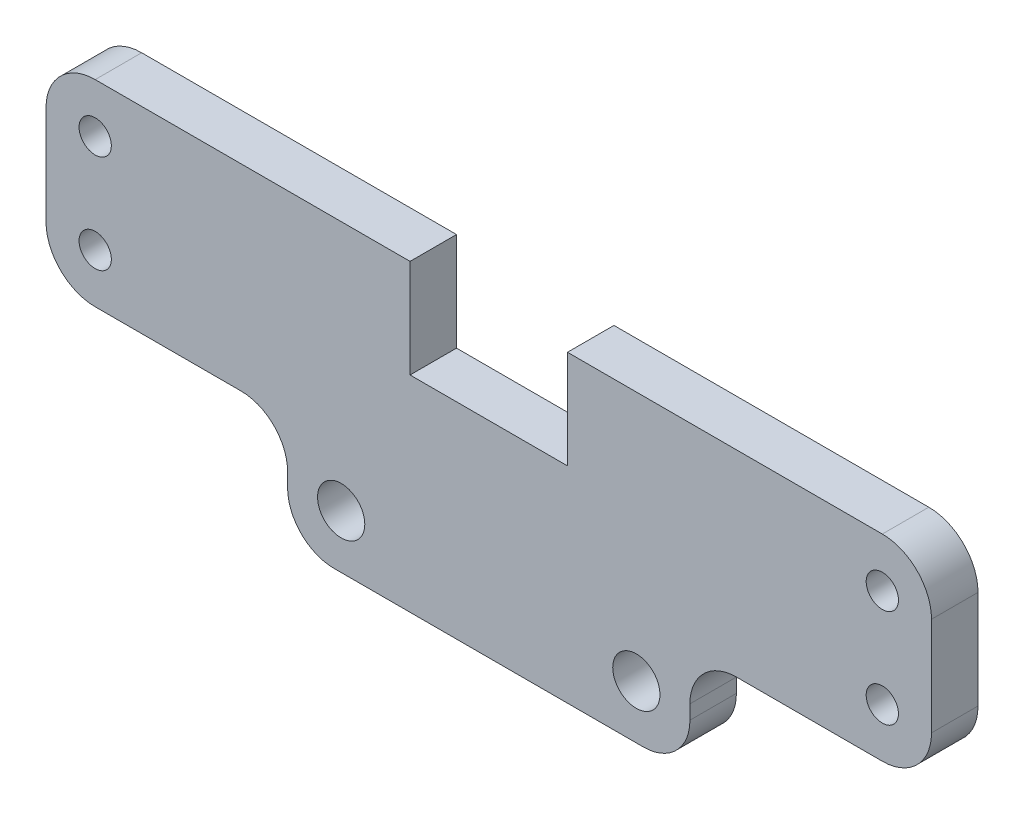
ISO-10303-21;
HEADER;
FILE_DESCRIPTION(('STEP AP214'),'2;1');
FILE_NAME('part.step','',(''),(''),'','','');
FILE_SCHEMA(('AUTOMOTIVE_DESIGN { 1 0 10303 214 1 1 1 1 }'));
ENDSEC;
DATA;
#1=APPLICATION_CONTEXT('core data for automotive mechanical design processes');
#2=APPLICATION_PROTOCOL_DEFINITION('international standard','automotive_design',2000,#1);
#3=PRODUCT_CONTEXT('',#1,'mechanical');
#4=PRODUCT('Part','Part','',(#3));
#5=PRODUCT_RELATED_PRODUCT_CATEGORY('part','',(#4));
#6=PRODUCT_DEFINITION_FORMATION('','',#4);
#7=PRODUCT_DEFINITION_CONTEXT('part definition',#1,'design');
#8=PRODUCT_DEFINITION('design','',#6,#7);
#9=PRODUCT_DEFINITION_SHAPE('','',#8);
#10=(LENGTH_UNIT() NAMED_UNIT(*) SI_UNIT(.MILLI.,.METRE.));
#11=(NAMED_UNIT(*) PLANE_ANGLE_UNIT() SI_UNIT($,.RADIAN.));
#12=(NAMED_UNIT(*) SI_UNIT($,.STERADIAN.) SOLID_ANGLE_UNIT());
#13=UNCERTAINTY_MEASURE_WITH_UNIT(LENGTH_MEASURE(1.E-05),#10,'distance_accuracy_value','');
#14=(GEOMETRIC_REPRESENTATION_CONTEXT(3) GLOBAL_UNCERTAINTY_ASSIGNED_CONTEXT((#13)) GLOBAL_UNIT_ASSIGNED_CONTEXT((#10,
#11,#12)) REPRESENTATION_CONTEXT('',''));
#15=CARTESIAN_POINT('',(0.,0.,0.));
#16=DIRECTION('',(0.,0.,1.));
#17=DIRECTION('',(1.,0.,0.));
#18=AXIS2_PLACEMENT_3D('',#15,#16,#17);
#19=CARTESIAN_POINT('',(-82.07375,-42.06875,3.));
#20=DIRECTION('',(0.,1.,0.));
#21=DIRECTION('',(0.,0.,1.));
#22=AXIS2_PLACEMENT_3D('',#19,#20,#21);
#23=PLANE('',#22);
#24=DIRECTION('',(1.,0.,0.));
#25=VECTOR('',#24,1.);
#26=CARTESIAN_POINT('',(-82.07375,-42.06875,3.));
#27=LINE('',#26,#25);
#28=CARTESIAN_POINT('',(0.691047213223217,-42.06875,3.));
#29=VERTEX_POINT('',#28);
#30=CARTESIAN_POINT('',(19.52625,-42.06875,3.));
#31=VERTEX_POINT('',#30);
#32=EDGE_CURVE('E283',#29,#31,#27,.T.);
#33=ORIENTED_EDGE('',*,*,#32,.F.);
#34=DIRECTION('',(0.,0.,1.));
#35=VECTOR('',#34,1.);
#36=CARTESIAN_POINT('',(0.69104721322324,-42.06875,-3.));
#37=LINE('',#36,#35);
#38=CARTESIAN_POINT('',(0.691047213223217,-42.06875,-3.));
#39=VERTEX_POINT('',#38);
#40=EDGE_CURVE('E55',#29,#39,#37,.F.);
#41=ORIENTED_EDGE('',*,*,#40,.T.);
#42=DIRECTION('',(1.,0.,0.));
#43=VECTOR('',#42,1.);
#44=CARTESIAN_POINT('',(-82.07375,-42.06875,-3.));
#45=LINE('',#44,#43);
#46=CARTESIAN_POINT('',(19.52625,-42.06875,-3.));
#47=VERTEX_POINT('',#46);
#48=EDGE_CURVE('E296',#39,#47,#45,.T.);
#49=ORIENTED_EDGE('',*,*,#48,.T.);
#50=DIRECTION('',(0.,0.,-1.));
#51=VECTOR('',#50,1.);
#52=CARTESIAN_POINT('',(19.52625,-42.06875,3.));
#53=LINE('',#52,#51);
#54=EDGE_CURVE('E236',#31,#47,#53,.T.);
#55=ORIENTED_EDGE('',*,*,#54,.F.);
#56=EDGE_LOOP('',(#33,#41,#49,#55));
#57=FACE_BOUND('',#56,.T.);
#58=ADVANCED_FACE('F40',(#57),#23,.F.);
#59=CARTESIAN_POINT('',(-82.0737500000001,-16.66875,3.));
#60=DIRECTION('',(0.,-1.,0.));
#61=DIRECTION('',(0.,0.,-1.));
#62=AXIS2_PLACEMENT_3D('',#59,#60,#61);
#63=PLANE('',#62);
#64=DIRECTION('',(-1.,0.,0.));
#65=VECTOR('',#64,1.);
#66=CARTESIAN_POINT('',(-82.0737500000001,-16.66875,-3.));
#67=LINE('',#66,#65);
#68=CARTESIAN_POINT('',(19.52625,-16.66875,-3.));
#69=VERTEX_POINT('',#68);
#70=CARTESIAN_POINT('',(-21.11375,-16.66875,-3.));
#71=VERTEX_POINT('',#70);
#72=EDGE_CURVE('E202',#69,#71,#67,.T.);
#73=ORIENTED_EDGE('',*,*,#72,.T.);
#74=DIRECTION('',(0.,0.,1.));
#75=VECTOR('',#74,1.);
#76=CARTESIAN_POINT('',(-21.11375,-16.66875,-3.));
#77=LINE('',#76,#75);
#78=CARTESIAN_POINT('',(-21.11375,-16.66875,3.));
#79=VERTEX_POINT('',#78);
#80=EDGE_CURVE('E183',#71,#79,#77,.T.);
#81=ORIENTED_EDGE('',*,*,#80,.T.);
#82=DIRECTION('',(-1.,0.,0.));
#83=VECTOR('',#82,1.);
#84=CARTESIAN_POINT('',(-82.0737500000001,-16.66875,3.));
#85=LINE('',#84,#83);
#86=CARTESIAN_POINT('',(19.52625,-16.66875,3.));
#87=VERTEX_POINT('',#86);
#88=EDGE_CURVE('E228',#87,#79,#85,.T.);
#89=ORIENTED_EDGE('',*,*,#88,.F.);
#90=DIRECTION('',(0.,0.,-1.));
#91=VECTOR('',#90,1.);
#92=CARTESIAN_POINT('',(19.52625,-16.66875,3.));
#93=LINE('',#92,#91);
#94=EDGE_CURVE('E211',#87,#69,#93,.T.);
#95=ORIENTED_EDGE('',*,*,#94,.T.);
#96=EDGE_LOOP('',(#73,#81,#89,#95));
#97=FACE_BOUND('',#96,.T.);
#98=ADVANCED_FACE('F209',(#97),#63,.F.);
#99=CARTESIAN_POINT('',(-82.07375,-23.01875,3.));
#100=DIRECTION('',(0.,0.,-1.));
#101=DIRECTION('',(-1.,0.,0.));
#102=AXIS2_PLACEMENT_3D('',#99,#100,#101);
#103=PLANE('',#102);
#104=DIRECTION('',(1.,0.,0.));
#105=VECTOR('',#104,1.);
#106=CARTESIAN_POINT('',(-57.2385472132233,-55.8983444264465,3.));
#107=LINE('',#106,#105);
#108=CARTESIAN_POINT('',(-51.2385472132233,-55.8983444264465,3.));
#109=VERTEX_POINT('',#108);
#110=CARTESIAN_POINT('',(-11.3089527867768,-55.8983444264465,3.));
#111=VERTEX_POINT('',#110);
#112=EDGE_CURVE('E316',#109,#111,#107,.T.);
#113=ORIENTED_EDGE('',*,*,#112,.T.);
#114=CARTESIAN_POINT('',(-11.3089527867768,-49.8983444264465,3.));
#115=DIRECTION('',(0.,0.,-1.));
#116=DIRECTION('',(-1.,0.,0.));
#117=AXIS2_PLACEMENT_3D('',#114,#115,#116);
#118=CIRCLE('',#117,6.);
#119=CARTESIAN_POINT('',(-5.30895278677676,-49.8983444264465,3.));
#120=VERTEX_POINT('',#119);
#121=EDGE_CURVE('E270',#111,#120,#118,.F.);
#122=ORIENTED_EDGE('',*,*,#121,.T.);
#123=DIRECTION('',(0.,-1.,0.));
#124=VECTOR('',#123,1.);
#125=CARTESIAN_POINT('',(-5.30895278677676,-55.8983444264465,3.));
#126=LINE('',#125,#124);
#127=CARTESIAN_POINT('',(-5.30895278677676,-48.06875,3.));
#128=VERTEX_POINT('',#127);
#129=EDGE_CURVE('E285',#128,#120,#126,.T.);
#130=ORIENTED_EDGE('',*,*,#129,.F.);
#131=CARTESIAN_POINT('',(0.69104721322324,-48.06875,3.));
#132=DIRECTION('',(0.,0.,-1.));
#133=DIRECTION('',(-1.,0.,0.));
#134=AXIS2_PLACEMENT_3D('',#131,#132,#133);
#135=CIRCLE('',#134,6.);
#136=EDGE_CURVE('E48',#128,#29,#135,.T.);
#137=ORIENTED_EDGE('',*,*,#136,.T.);
#138=ORIENTED_EDGE('',*,*,#32,.T.);
#139=CARTESIAN_POINT('',(19.52625,-35.71875,3.));
#140=DIRECTION('',(0.,0.,1.));
#141=DIRECTION('',(1.,0.,0.));
#142=AXIS2_PLACEMENT_3D('',#139,#140,#141);
#143=CIRCLE('',#142,6.35);
#144=CARTESIAN_POINT('',(25.87625,-35.71875,3.));
#145=VERTEX_POINT('',#144);
#146=EDGE_CURVE('E367',#31,#145,#143,.T.);
#147=ORIENTED_EDGE('',*,*,#146,.T.);
#148=DIRECTION('',(0.,1.,0.));
#149=VECTOR('',#148,1.);
#150=CARTESIAN_POINT('',(25.87625,-35.71875,3.));
#151=LINE('',#150,#149);
#152=CARTESIAN_POINT('',(25.87625,-23.01875,3.));
#153=VERTEX_POINT('',#152);
#154=EDGE_CURVE('E369',#145,#153,#151,.T.);
#155=ORIENTED_EDGE('',*,*,#154,.T.);
#156=CARTESIAN_POINT('',(19.52625,-23.01875,3.));
#157=DIRECTION('',(0.,0.,1.));
#158=DIRECTION('',(-1.,0.,0.));
#159=AXIS2_PLACEMENT_3D('',#156,#157,#158);
#160=CIRCLE('',#159,6.35);
#161=EDGE_CURVE('E371',#153,#87,#160,.T.);
#162=ORIENTED_EDGE('',*,*,#161,.T.);
#163=ORIENTED_EDGE('',*,*,#88,.T.);
#164=DIRECTION('',(0.,1.,0.));
#165=VECTOR('',#164,1.);
#166=CARTESIAN_POINT('',(-21.11375,-16.66875,3.));
#167=LINE('',#166,#165);
#168=CARTESIAN_POINT('',(-21.11375,-29.36875,3.));
#169=VERTEX_POINT('',#168);
#170=EDGE_CURVE('E189',#169,#79,#167,.T.);
#171=ORIENTED_EDGE('',*,*,#170,.F.);
#172=DIRECTION('',(1.,0.,0.));
#173=VECTOR('',#172,1.);
#174=CARTESIAN_POINT('',(-21.11375,-29.36875,3.));
#175=LINE('',#174,#173);
#176=CARTESIAN_POINT('',(-41.43375,-29.36875,3.));
#177=VERTEX_POINT('',#176);
#178=EDGE_CURVE('E206',#177,#169,#175,.T.);
#179=ORIENTED_EDGE('',*,*,#178,.F.);
#180=DIRECTION('',(0.,-1.,0.));
#181=VECTOR('',#180,1.);
#182=CARTESIAN_POINT('',(-41.43375,-16.66875,3.));
#183=LINE('',#182,#181);
#184=CARTESIAN_POINT('',(-41.43375,-16.66875,3.));
#185=VERTEX_POINT('',#184);
#186=EDGE_CURVE('E325',#185,#177,#183,.T.);
#187=ORIENTED_EDGE('',*,*,#186,.F.);
#188=CARTESIAN_POINT('',(-82.0737500000001,-16.66875,3.));
#189=VERTEX_POINT('',#188);
#190=EDGE_CURVE('E373',#185,#189,#85,.T.);
#191=ORIENTED_EDGE('',*,*,#190,.T.);
#192=CARTESIAN_POINT('',(-82.07375,-23.01875,3.));
#193=DIRECTION('',(0.,0.,1.));
#194=DIRECTION('',(-1.,0.,0.));
#195=AXIS2_PLACEMENT_3D('',#192,#193,#194);
#196=CIRCLE('',#195,6.34999999999998);
#197=CARTESIAN_POINT('',(-88.42375,-23.01875,3.));
#198=VERTEX_POINT('',#197);
#199=EDGE_CURVE('E212',#189,#198,#196,.T.);
#200=ORIENTED_EDGE('',*,*,#199,.T.);
#201=DIRECTION('',(0.,-1.,0.));
#202=VECTOR('',#201,1.);
#203=CARTESIAN_POINT('',(-88.42375,-23.01875,3.));
#204=LINE('',#203,#202);
#205=CARTESIAN_POINT('',(-88.42375,-35.71875,3.));
#206=VERTEX_POINT('',#205);
#207=EDGE_CURVE('E217',#198,#206,#204,.T.);
#208=ORIENTED_EDGE('',*,*,#207,.T.);
#209=CARTESIAN_POINT('',(-82.07375,-35.71875,3.));
#210=DIRECTION('',(0.,0.,1.));
#211=DIRECTION('',(1.,0.,0.));
#212=AXIS2_PLACEMENT_3D('',#209,#210,#211);
#213=CIRCLE('',#212,6.35);
#214=CARTESIAN_POINT('',(-82.07375,-42.06875,3.));
#215=VERTEX_POINT('',#214);
#216=EDGE_CURVE('E290',#206,#215,#213,.T.);
#217=ORIENTED_EDGE('',*,*,#216,.T.);
#218=CARTESIAN_POINT('',(-63.2385472132233,-42.06875,3.));
#219=VERTEX_POINT('',#218);
#220=EDGE_CURVE('E289',#215,#219,#27,.T.);
#221=ORIENTED_EDGE('',*,*,#220,.T.);
#222=CARTESIAN_POINT('',(-63.2385472132233,-48.06875,3.));
#223=DIRECTION('',(0.,0.,-1.));
#224=DIRECTION('',(-1.,0.,0.));
#225=AXIS2_PLACEMENT_3D('',#222,#223,#224);
#226=CIRCLE('',#225,6.);
#227=CARTESIAN_POINT('',(-57.2385472132233,-48.06875,3.));
#228=VERTEX_POINT('',#227);
#229=EDGE_CURVE('E263',#219,#228,#226,.T.);
#230=ORIENTED_EDGE('',*,*,#229,.T.);
#231=DIRECTION('',(0.,-1.,0.));
#232=VECTOR('',#231,1.);
#233=CARTESIAN_POINT('',(-57.2385472132233,-55.8983444264465,3.));
#234=LINE('',#233,#232);
#235=CARTESIAN_POINT('',(-57.2385472132233,-49.8983444264465,3.));
#236=VERTEX_POINT('',#235);
#237=EDGE_CURVE('E310',#228,#236,#234,.T.);
#238=ORIENTED_EDGE('',*,*,#237,.T.);
#239=CARTESIAN_POINT('',(-51.2385472132233,-49.8983444264465,3.));
#240=DIRECTION('',(0.,0.,-1.));
#241=DIRECTION('',(-1.,0.,0.));
#242=AXIS2_PLACEMENT_3D('',#239,#240,#241);
#243=CIRCLE('',#242,6.);
#244=EDGE_CURVE('E254',#236,#109,#243,.F.);
#245=ORIENTED_EDGE('',*,*,#244,.T.);
#246=EDGE_LOOP('',(#113,#122,#130,#137,#138,#147,#155,#162,#163,#171,#179,#187,#191,#200,#208,
#217,#221,#230,#238,#245));
#247=FACE_BOUND('',#246,.T.);
#248=CARTESIAN_POINT('',(-82.07375,-23.01875,3.));
#249=DIRECTION('',(0.,0.,1.));
#250=DIRECTION('',(1.,0.,0.));
#251=AXIS2_PLACEMENT_3D('',#248,#249,#250);
#252=CIRCLE('',#251,2.0828);
#253=CARTESIAN_POINT('',(-79.99095,-23.01875,3.));
#254=VERTEX_POINT('',#253);
#255=EDGE_CURVE('E355',#254,#254,#252,.T.);
#256=ORIENTED_EDGE('',*,*,#255,.F.);
#257=EDGE_LOOP('',(#256));
#258=FACE_BOUND('',#257,.T.);
#259=CARTESIAN_POINT('',(19.52625,-23.01875,3.));
#260=DIRECTION('',(0.,0.,1.));
#261=DIRECTION('',(1.,0.,0.));
#262=AXIS2_PLACEMENT_3D('',#259,#260,#261);
#263=CIRCLE('',#262,2.0828);
#264=CARTESIAN_POINT('',(21.60905,-23.01875,3.));
#265=VERTEX_POINT('',#264);
#266=EDGE_CURVE('E349',#265,#265,#263,.T.);
#267=ORIENTED_EDGE('',*,*,#266,.F.);
#268=EDGE_LOOP('',(#267));
#269=FACE_BOUND('',#268,.T.);
#270=CARTESIAN_POINT('',(-82.07375,-35.71875,3.));
#271=DIRECTION('',(0.,0.,1.));
#272=DIRECTION('',(1.,0.,0.));
#273=AXIS2_PLACEMENT_3D('',#270,#271,#272);
#274=CIRCLE('',#273,2.0828);
#275=CARTESIAN_POINT('',(-79.99095,-35.71875,3.));
#276=VERTEX_POINT('',#275);
#277=EDGE_CURVE('E342',#276,#276,#274,.T.);
#278=ORIENTED_EDGE('',*,*,#277,.F.);
#279=EDGE_LOOP('',(#278));
#280=FACE_BOUND('',#279,.T.);
#281=CARTESIAN_POINT('',(19.52625,-35.71875,3.));
#282=DIRECTION('',(0.,0.,1.));
#283=DIRECTION('',(1.,0.,0.));
#284=AXIS2_PLACEMENT_3D('',#281,#282,#283);
#285=CIRCLE('',#284,2.0828);
#286=CARTESIAN_POINT('',(21.60905,-35.71875,3.));
#287=VERTEX_POINT('',#286);
#288=EDGE_CURVE('E336',#287,#287,#285,.T.);
#289=ORIENTED_EDGE('',*,*,#288,.F.);
#290=EDGE_LOOP('',(#289));
#291=FACE_BOUND('',#290,.T.);
#292=CARTESIAN_POINT('',(-50.32375,-48.9835472132233,3.));
#293=DIRECTION('',(0.,0.,1.));
#294=DIRECTION('',(1.,0.,0.));
#295=AXIS2_PLACEMENT_3D('',#292,#293,#294);
#296=CIRCLE('',#295,3.048);
#297=CARTESIAN_POINT('',(-47.27575,-48.9835472132233,3.));
#298=VERTEX_POINT('',#297);
#299=EDGE_CURVE('E298',#298,#298,#296,.T.);
#300=ORIENTED_EDGE('',*,*,#299,.F.);
#301=EDGE_LOOP('',(#300));
#302=FACE_BOUND('',#301,.T.);
#303=CARTESIAN_POINT('',(-12.22375,-48.9835472132233,3.));
#304=DIRECTION('',(0.,0.,-1.));
#305=DIRECTION('',(-1.,0.,0.));
#306=AXIS2_PLACEMENT_3D('',#303,#304,#305);
#307=CIRCLE('',#306,3.048);
#308=CARTESIAN_POINT('',(-15.27175,-48.9835472132233,3.));
#309=VERTEX_POINT('',#308);
#310=EDGE_CURVE('E306',#309,#309,#307,.T.);
#311=ORIENTED_EDGE('',*,*,#310,.T.);
#312=EDGE_LOOP('',(#311));
#313=FACE_BOUND('',#312,.T.);
#314=ADVANCED_FACE('F281',(#247,#258,#269,#280,#291,#302,#313),#103,.F.);
#315=CARTESIAN_POINT('',(-82.07375,-23.01875,-3.));
#316=DIRECTION('',(0.,0.,-1.));
#317=DIRECTION('',(-1.,0.,0.));
#318=AXIS2_PLACEMENT_3D('',#315,#316,#317);
#319=PLANE('',#318);
#320=DIRECTION('',(0.,-1.,0.));
#321=VECTOR('',#320,1.);
#322=CARTESIAN_POINT('',(-5.30895278677676,-55.8983444264465,-3.));
#323=LINE('',#322,#321);
#324=CARTESIAN_POINT('',(-5.30895278677676,-48.06875,-3.));
#325=VERTEX_POINT('',#324);
#326=CARTESIAN_POINT('',(-5.30895278677676,-49.8983444264465,-3.));
#327=VERTEX_POINT('',#326);
#328=EDGE_CURVE('E293',#325,#327,#323,.T.);
#329=ORIENTED_EDGE('',*,*,#328,.T.);
#330=CARTESIAN_POINT('',(-11.3089527867768,-49.8983444264465,-3.));
#331=DIRECTION('',(0.,0.,-1.));
#332=DIRECTION('',(-1.,0.,0.));
#333=AXIS2_PLACEMENT_3D('',#330,#331,#332);
#334=CIRCLE('',#333,6.);
#335=CARTESIAN_POINT('',(-11.3089527867768,-55.8983444264465,-3.));
#336=VERTEX_POINT('',#335);
#337=EDGE_CURVE('E276',#327,#336,#334,.T.);
#338=ORIENTED_EDGE('',*,*,#337,.T.);
#339=DIRECTION('',(1.,0.,0.));
#340=VECTOR('',#339,1.);
#341=CARTESIAN_POINT('',(-57.2385472132233,-55.8983444264465,-3.));
#342=LINE('',#341,#340);
#343=CARTESIAN_POINT('',(-51.2385472132233,-55.8983444264465,-3.));
#344=VERTEX_POINT('',#343);
#345=EDGE_CURVE('E315',#344,#336,#342,.T.);
#346=ORIENTED_EDGE('',*,*,#345,.F.);
#347=CARTESIAN_POINT('',(-51.2385472132233,-49.8983444264465,-3.));
#348=DIRECTION('',(0.,0.,-1.));
#349=DIRECTION('',(-1.,0.,0.));
#350=AXIS2_PLACEMENT_3D('',#347,#348,#349);
#351=CIRCLE('',#350,6.);
#352=CARTESIAN_POINT('',(-57.2385472132233,-49.8983444264465,-3.));
#353=VERTEX_POINT('',#352);
#354=EDGE_CURVE('E258',#344,#353,#351,.T.);
#355=ORIENTED_EDGE('',*,*,#354,.T.);
#356=DIRECTION('',(0.,-1.,0.));
#357=VECTOR('',#356,1.);
#358=CARTESIAN_POINT('',(-57.2385472132233,-55.8983444264465,-3.));
#359=LINE('',#358,#357);
#360=CARTESIAN_POINT('',(-57.2385472132233,-48.06875,-3.));
#361=VERTEX_POINT('',#360);
#362=EDGE_CURVE('E312',#361,#353,#359,.T.);
#363=ORIENTED_EDGE('',*,*,#362,.F.);
#364=CARTESIAN_POINT('',(-63.2385472132233,-48.06875,-3.));
#365=DIRECTION('',(0.,0.,-1.));
#366=DIRECTION('',(-1.,0.,0.));
#367=AXIS2_PLACEMENT_3D('',#364,#365,#366);
#368=CIRCLE('',#367,6.);
#369=CARTESIAN_POINT('',(-63.2385472132233,-42.06875,-3.));
#370=VERTEX_POINT('',#369);
#371=EDGE_CURVE('E265',#361,#370,#368,.F.);
#372=ORIENTED_EDGE('',*,*,#371,.T.);
#373=CARTESIAN_POINT('',(-82.07375,-42.06875,-3.));
#374=VERTEX_POINT('',#373);
#375=EDGE_CURVE('E383',#374,#370,#45,.T.);
#376=ORIENTED_EDGE('',*,*,#375,.F.);
#377=CARTESIAN_POINT('',(-82.07375,-35.71875,-3.));
#378=DIRECTION('',(0.,0.,1.));
#379=DIRECTION('',(1.,0.,0.));
#380=AXIS2_PLACEMENT_3D('',#377,#378,#379);
#381=CIRCLE('',#380,6.35);
#382=CARTESIAN_POINT('',(-88.42375,-35.71875,-3.));
#383=VERTEX_POINT('',#382);
#384=EDGE_CURVE('E381',#383,#374,#381,.T.);
#385=ORIENTED_EDGE('',*,*,#384,.F.);
#386=DIRECTION('',(0.,-1.,0.));
#387=VECTOR('',#386,1.);
#388=CARTESIAN_POINT('',(-88.42375,-23.01875,-3.));
#389=LINE('',#388,#387);
#390=CARTESIAN_POINT('',(-88.42375,-23.01875,-3.));
#391=VERTEX_POINT('',#390);
#392=EDGE_CURVE('E378',#391,#383,#389,.T.);
#393=ORIENTED_EDGE('',*,*,#392,.F.);
#394=CARTESIAN_POINT('',(-82.07375,-23.01875,-3.));
#395=DIRECTION('',(0.,0.,1.));
#396=DIRECTION('',(-1.,0.,0.));
#397=AXIS2_PLACEMENT_3D('',#394,#395,#396);
#398=CIRCLE('',#397,6.34999999999998);
#399=CARTESIAN_POINT('',(-82.0737500000001,-16.66875,-3.));
#400=VERTEX_POINT('',#399);
#401=EDGE_CURVE('E359',#400,#391,#398,.T.);
#402=ORIENTED_EDGE('',*,*,#401,.F.);
#403=CARTESIAN_POINT('',(-41.43375,-16.66875,-3.));
#404=VERTEX_POINT('',#403);
#405=EDGE_CURVE('E213',#404,#400,#67,.T.);
#406=ORIENTED_EDGE('',*,*,#405,.F.);
#407=DIRECTION('',(0.,-1.,0.));
#408=VECTOR('',#407,1.);
#409=CARTESIAN_POINT('',(-41.43375,-16.66875,-3.));
#410=LINE('',#409,#408);
#411=CARTESIAN_POINT('',(-41.43375,-29.36875,-3.));
#412=VERTEX_POINT('',#411);
#413=EDGE_CURVE('E205',#404,#412,#410,.T.);
#414=ORIENTED_EDGE('',*,*,#413,.T.);
#415=DIRECTION('',(1.,0.,0.));
#416=VECTOR('',#415,1.);
#417=CARTESIAN_POINT('',(-21.11375,-29.36875,-3.));
#418=LINE('',#417,#416);
#419=CARTESIAN_POINT('',(-21.11375,-29.36875,-3.));
#420=VERTEX_POINT('',#419);
#421=EDGE_CURVE('E195',#412,#420,#418,.T.);
#422=ORIENTED_EDGE('',*,*,#421,.T.);
#423=DIRECTION('',(0.,1.,0.));
#424=VECTOR('',#423,1.);
#425=CARTESIAN_POINT('',(-21.11375,-16.66875,-3.));
#426=LINE('',#425,#424);
#427=EDGE_CURVE('E186',#420,#71,#426,.T.);
#428=ORIENTED_EDGE('',*,*,#427,.T.);
#429=ORIENTED_EDGE('',*,*,#72,.F.);
#430=CARTESIAN_POINT('',(19.52625,-23.01875,-3.));
#431=DIRECTION('',(0.,0.,1.));
#432=DIRECTION('',(-1.,0.,0.));
#433=AXIS2_PLACEMENT_3D('',#430,#431,#432);
#434=CIRCLE('',#433,6.35);
#435=CARTESIAN_POINT('',(25.87625,-23.01875,-3.));
#436=VERTEX_POINT('',#435);
#437=EDGE_CURVE('E220',#436,#69,#434,.T.);
#438=ORIENTED_EDGE('',*,*,#437,.F.);
#439=DIRECTION('',(0.,1.,0.));
#440=VECTOR('',#439,1.);
#441=CARTESIAN_POINT('',(25.87625,-35.71875,-3.));
#442=LINE('',#441,#440);
#443=CARTESIAN_POINT('',(25.87625,-35.71875,-3.));
#444=VERTEX_POINT('',#443);
#445=EDGE_CURVE('E387',#444,#436,#442,.T.);
#446=ORIENTED_EDGE('',*,*,#445,.F.);
#447=CARTESIAN_POINT('',(19.52625,-35.71875,-3.));
#448=DIRECTION('',(0.,0.,1.));
#449=DIRECTION('',(1.,0.,0.));
#450=AXIS2_PLACEMENT_3D('',#447,#448,#449);
#451=CIRCLE('',#450,6.35);
#452=EDGE_CURVE('E386',#47,#444,#451,.T.);
#453=ORIENTED_EDGE('',*,*,#452,.F.);
#454=ORIENTED_EDGE('',*,*,#48,.F.);
#455=CARTESIAN_POINT('',(0.69104721322324,-48.06875,-3.));
#456=DIRECTION('',(0.,0.,-1.));
#457=DIRECTION('',(-1.,0.,0.));
#458=AXIS2_PLACEMENT_3D('',#455,#456,#457);
#459=CIRCLE('',#458,6.);
#460=EDGE_CURVE('E11',#39,#325,#459,.F.);
#461=ORIENTED_EDGE('',*,*,#460,.T.);
#462=EDGE_LOOP('',(#329,#338,#346,#355,#363,#372,#376,#385,#393,#402,#406,#414,#422,#428,#429,
#438,#446,#453,#454,#461));
#463=FACE_BOUND('',#462,.T.);
#464=CARTESIAN_POINT('',(-82.07375,-35.71875,-3.));
#465=DIRECTION('',(0.,0.,1.));
#466=DIRECTION('',(1.,0.,0.));
#467=AXIS2_PLACEMENT_3D('',#464,#465,#466);
#468=CIRCLE('',#467,2.0828);
#469=CARTESIAN_POINT('',(-79.99095,-35.71875,-3.));
#470=VERTEX_POINT('',#469);
#471=EDGE_CURVE('E339',#470,#470,#468,.T.);
#472=ORIENTED_EDGE('',*,*,#471,.T.);
#473=EDGE_LOOP('',(#472));
#474=FACE_BOUND('',#473,.T.);
#475=CARTESIAN_POINT('',(-82.07375,-23.01875,-3.));
#476=DIRECTION('',(0.,0.,1.));
#477=DIRECTION('',(1.,0.,0.));
#478=AXIS2_PLACEMENT_3D('',#475,#476,#477);
#479=CIRCLE('',#478,2.0828);
#480=CARTESIAN_POINT('',(-79.99095,-23.01875,-3.));
#481=VERTEX_POINT('',#480);
#482=EDGE_CURVE('E352',#481,#481,#479,.T.);
#483=ORIENTED_EDGE('',*,*,#482,.T.);
#484=EDGE_LOOP('',(#483));
#485=FACE_BOUND('',#484,.T.);
#486=CARTESIAN_POINT('',(19.52625,-23.01875,-3.));
#487=DIRECTION('',(0.,0.,1.));
#488=DIRECTION('',(1.,0.,0.));
#489=AXIS2_PLACEMENT_3D('',#486,#487,#488);
#490=CIRCLE('',#489,2.0828);
#491=CARTESIAN_POINT('',(21.60905,-23.01875,-3.));
#492=VERTEX_POINT('',#491);
#493=EDGE_CURVE('E346',#492,#492,#490,.T.);
#494=ORIENTED_EDGE('',*,*,#493,.T.);
#495=EDGE_LOOP('',(#494));
#496=FACE_BOUND('',#495,.T.);
#497=CARTESIAN_POINT('',(19.52625,-35.71875,-3.));
#498=DIRECTION('',(0.,0.,1.));
#499=DIRECTION('',(1.,0.,0.));
#500=AXIS2_PLACEMENT_3D('',#497,#498,#499);
#501=CIRCLE('',#500,2.0828);
#502=CARTESIAN_POINT('',(21.60905,-35.71875,-3.));
#503=VERTEX_POINT('',#502);
#504=EDGE_CURVE('E332',#503,#503,#501,.T.);
#505=ORIENTED_EDGE('',*,*,#504,.T.);
#506=EDGE_LOOP('',(#505));
#507=FACE_BOUND('',#506,.T.);
#508=CARTESIAN_POINT('',(-50.32375,-48.9835472132233,-3.));
#509=DIRECTION('',(0.,0.,1.));
#510=DIRECTION('',(1.,0.,0.));
#511=AXIS2_PLACEMENT_3D('',#508,#509,#510);
#512=CIRCLE('',#511,3.048);
#513=CARTESIAN_POINT('',(-47.27575,-48.9835472132233,-3.));
#514=VERTEX_POINT('',#513);
#515=EDGE_CURVE('E301',#514,#514,#512,.T.);
#516=ORIENTED_EDGE('',*,*,#515,.T.);
#517=EDGE_LOOP('',(#516));
#518=FACE_BOUND('',#517,.T.);
#519=CARTESIAN_POINT('',(-12.22375,-48.9835472132233,-3.));
#520=DIRECTION('',(0.,0.,-1.));
#521=DIRECTION('',(-1.,0.,0.));
#522=AXIS2_PLACEMENT_3D('',#519,#520,#521);
#523=CIRCLE('',#522,3.048);
#524=CARTESIAN_POINT('',(-15.27175,-48.9835472132233,-3.));
#525=VERTEX_POINT('',#524);
#526=EDGE_CURVE('E303',#525,#525,#523,.T.);
#527=ORIENTED_EDGE('',*,*,#526,.F.);
#528=EDGE_LOOP('',(#527));
#529=FACE_BOUND('',#528,.T.);
#530=ADVANCED_FACE('F199',(#463,#474,#485,#496,#507,#518,#529),#319,.T.);
#531=CARTESIAN_POINT('',(-82.07375,-23.01875,3.));
#532=DIRECTION('',(0.,0.,-1.));
#533=DIRECTION('',(-1.,0.,0.));
#534=AXIS2_PLACEMENT_3D('',#531,#532,#533);
#535=CYLINDRICAL_SURFACE('',#534,6.34999999999998);
#536=ORIENTED_EDGE('',*,*,#401,.T.);
#537=DIRECTION('',(0.,0.,-1.));
#538=VECTOR('',#537,1.);
#539=CARTESIAN_POINT('',(-88.42375,-23.01875,3.));
#540=LINE('',#539,#538);
#541=EDGE_CURVE('E245',#198,#391,#540,.T.);
#542=ORIENTED_EDGE('',*,*,#541,.F.);
#543=ORIENTED_EDGE('',*,*,#199,.F.);
#544=DIRECTION('',(0.,0.,-1.));
#545=VECTOR('',#544,1.);
#546=CARTESIAN_POINT('',(-82.0737500000001,-16.66875,3.));
#547=LINE('',#546,#545);
#548=EDGE_CURVE('E224',#189,#400,#547,.T.);
#549=ORIENTED_EDGE('',*,*,#548,.T.);
#550=EDGE_LOOP('',(#536,#542,#543,#549));
#551=FACE_BOUND('',#550,.T.);
#552=ADVANCED_FACE('F415',(#551),#535,.T.);
#553=CARTESIAN_POINT('',(-88.42375,-23.01875,3.));
#554=DIRECTION('',(1.,0.,0.));
#555=DIRECTION('',(0.,1.,0.));
#556=AXIS2_PLACEMENT_3D('',#553,#554,#555);
#557=PLANE('',#556);
#558=ORIENTED_EDGE('',*,*,#392,.T.);
#559=DIRECTION('',(0.,0.,-1.));
#560=VECTOR('',#559,1.);
#561=CARTESIAN_POINT('',(-88.42375,-35.71875,3.));
#562=LINE('',#561,#560);
#563=EDGE_CURVE('E242',#206,#383,#562,.T.);
#564=ORIENTED_EDGE('',*,*,#563,.F.);
#565=ORIENTED_EDGE('',*,*,#207,.F.);
#566=ORIENTED_EDGE('',*,*,#541,.T.);
#567=EDGE_LOOP('',(#558,#564,#565,#566));
#568=FACE_BOUND('',#567,.T.);
#569=ADVANCED_FACE('F454',(#568),#557,.F.);
#570=CARTESIAN_POINT('',(-82.07375,-35.71875,3.));
#571=DIRECTION('',(0.,0.,-1.));
#572=DIRECTION('',(-1.,0.,0.));
#573=AXIS2_PLACEMENT_3D('',#570,#571,#572);
#574=CYLINDRICAL_SURFACE('',#573,6.35);
#575=ORIENTED_EDGE('',*,*,#384,.T.);
#576=DIRECTION('',(0.,0.,-1.));
#577=VECTOR('',#576,1.);
#578=CARTESIAN_POINT('',(-82.07375,-42.06875,3.));
#579=LINE('',#578,#577);
#580=EDGE_CURVE('E239',#215,#374,#579,.T.);
#581=ORIENTED_EDGE('',*,*,#580,.F.);
#582=ORIENTED_EDGE('',*,*,#216,.F.);
#583=ORIENTED_EDGE('',*,*,#563,.T.);
#584=EDGE_LOOP('',(#575,#581,#582,#583));
#585=FACE_BOUND('',#584,.T.);
#586=ADVANCED_FACE('F448',(#585),#574,.T.);
#587=ORIENTED_EDGE('',*,*,#375,.T.);
#588=DIRECTION('',(0.,0.,1.));
#589=VECTOR('',#588,1.);
#590=CARTESIAN_POINT('',(-63.2385472132233,-42.06875,3.));
#591=LINE('',#590,#589);
#592=EDGE_CURVE('E260',#370,#219,#591,.T.);
#593=ORIENTED_EDGE('',*,*,#592,.T.);
#594=ORIENTED_EDGE('',*,*,#220,.F.);
#595=ORIENTED_EDGE('',*,*,#580,.T.);
#596=EDGE_LOOP('',(#587,#593,#594,#595));
#597=FACE_BOUND('',#596,.T.);
#598=ADVANCED_FACE('F440',(#597),#23,.F.);
#599=CARTESIAN_POINT('',(19.52625,-35.71875,3.));
#600=DIRECTION('',(0.,0.,-1.));
#601=DIRECTION('',(-1.,0.,0.));
#602=AXIS2_PLACEMENT_3D('',#599,#600,#601);
#603=CYLINDRICAL_SURFACE('',#602,6.35);
#604=ORIENTED_EDGE('',*,*,#452,.T.);
#605=DIRECTION('',(0.,0.,-1.));
#606=VECTOR('',#605,1.);
#607=CARTESIAN_POINT('',(25.87625,-35.71875,3.));
#608=LINE('',#607,#606);
#609=EDGE_CURVE('E233',#145,#444,#608,.T.);
#610=ORIENTED_EDGE('',*,*,#609,.F.);
#611=ORIENTED_EDGE('',*,*,#146,.F.);
#612=ORIENTED_EDGE('',*,*,#54,.T.);
#613=EDGE_LOOP('',(#604,#610,#611,#612));
#614=FACE_BOUND('',#613,.T.);
#615=ADVANCED_FACE('F396',(#614),#603,.T.);
#616=CARTESIAN_POINT('',(25.87625,-35.71875,3.));
#617=DIRECTION('',(-1.,0.,0.));
#618=DIRECTION('',(0.,-1.,0.));
#619=AXIS2_PLACEMENT_3D('',#616,#617,#618);
#620=PLANE('',#619);
#621=ORIENTED_EDGE('',*,*,#445,.T.);
#622=DIRECTION('',(0.,0.,-1.));
#623=VECTOR('',#622,1.);
#624=CARTESIAN_POINT('',(25.87625,-23.01875,3.));
#625=LINE('',#624,#623);
#626=EDGE_CURVE('E230',#153,#436,#625,.T.);
#627=ORIENTED_EDGE('',*,*,#626,.F.);
#628=ORIENTED_EDGE('',*,*,#154,.F.);
#629=ORIENTED_EDGE('',*,*,#609,.T.);
#630=EDGE_LOOP('',(#621,#627,#628,#629));
#631=FACE_BOUND('',#630,.T.);
#632=ADVANCED_FACE('F398',(#631),#620,.F.);
#633=CARTESIAN_POINT('',(19.52625,-23.01875,3.));
#634=DIRECTION('',(0.,0.,-1.));
#635=DIRECTION('',(-1.,0.,0.));
#636=AXIS2_PLACEMENT_3D('',#633,#634,#635);
#637=CYLINDRICAL_SURFACE('',#636,6.35);
#638=ORIENTED_EDGE('',*,*,#437,.T.);
#639=ORIENTED_EDGE('',*,*,#94,.F.);
#640=ORIENTED_EDGE('',*,*,#161,.F.);
#641=ORIENTED_EDGE('',*,*,#626,.T.);
#642=EDGE_LOOP('',(#638,#639,#640,#641));
#643=FACE_BOUND('',#642,.T.);
#644=ADVANCED_FACE('F392',(#643),#637,.T.);
#645=ORIENTED_EDGE('',*,*,#190,.F.);
#646=DIRECTION('',(0.,0.,1.));
#647=VECTOR('',#646,1.);
#648=CARTESIAN_POINT('',(-41.43375,-16.66875,-3.));
#649=LINE('',#648,#647);
#650=EDGE_CURVE('E194',#404,#185,#649,.T.);
#651=ORIENTED_EDGE('',*,*,#650,.F.);
#652=ORIENTED_EDGE('',*,*,#405,.T.);
#653=ORIENTED_EDGE('',*,*,#548,.F.);
#654=EDGE_LOOP('',(#645,#651,#652,#653));
#655=FACE_BOUND('',#654,.T.);
#656=ADVANCED_FACE('F409',(#655),#63,.F.);
#657=CARTESIAN_POINT('',(-82.07375,-23.01875,3.));
#658=DIRECTION('',(0.,0.,-1.));
#659=DIRECTION('',(-1.,0.,0.));
#660=AXIS2_PLACEMENT_3D('',#657,#658,#659);
#661=CYLINDRICAL_SURFACE('',#660,2.0828);
#662=ORIENTED_EDGE('',*,*,#255,.T.);
#663=EDGE_LOOP('',(#662));
#664=FACE_BOUND('',#663,.T.);
#665=ORIENTED_EDGE('',*,*,#482,.F.);
#666=EDGE_LOOP('',(#665));
#667=FACE_BOUND('',#666,.T.);
#668=ADVANCED_FACE('F503',(#664,#667),#661,.F.);
#669=CARTESIAN_POINT('',(19.52625,-23.01875,3.));
#670=DIRECTION('',(0.,0.,-1.));
#671=DIRECTION('',(-1.,0.,0.));
#672=AXIS2_PLACEMENT_3D('',#669,#670,#671);
#673=CYLINDRICAL_SURFACE('',#672,2.0828);
#674=ORIENTED_EDGE('',*,*,#266,.T.);
#675=EDGE_LOOP('',(#674));
#676=FACE_BOUND('',#675,.T.);
#677=ORIENTED_EDGE('',*,*,#493,.F.);
#678=EDGE_LOOP('',(#677));
#679=FACE_BOUND('',#678,.T.);
#680=ADVANCED_FACE('F499',(#676,#679),#673,.F.);
#681=CARTESIAN_POINT('',(-82.07375,-35.71875,3.));
#682=DIRECTION('',(0.,0.,-1.));
#683=DIRECTION('',(-1.,0.,0.));
#684=AXIS2_PLACEMENT_3D('',#681,#682,#683);
#685=CYLINDRICAL_SURFACE('',#684,2.0828);
#686=ORIENTED_EDGE('',*,*,#277,.T.);
#687=EDGE_LOOP('',(#686));
#688=FACE_BOUND('',#687,.T.);
#689=ORIENTED_EDGE('',*,*,#471,.F.);
#690=EDGE_LOOP('',(#689));
#691=FACE_BOUND('',#690,.T.);
#692=ADVANCED_FACE('F495',(#688,#691),#685,.F.);
#693=CARTESIAN_POINT('',(19.52625,-35.71875,3.));
#694=DIRECTION('',(0.,0.,-1.));
#695=DIRECTION('',(-1.,0.,0.));
#696=AXIS2_PLACEMENT_3D('',#693,#694,#695);
#697=CYLINDRICAL_SURFACE('',#696,2.0828);
#698=ORIENTED_EDGE('',*,*,#288,.T.);
#699=EDGE_LOOP('',(#698));
#700=FACE_BOUND('',#699,.T.);
#701=ORIENTED_EDGE('',*,*,#504,.F.);
#702=EDGE_LOOP('',(#701));
#703=FACE_BOUND('',#702,.T.);
#704=ADVANCED_FACE('F492',(#700,#703),#697,.F.);
#705=CARTESIAN_POINT('',(-21.11375,-16.66875,-3.));
#706=DIRECTION('',(1.,0.,0.));
#707=DIRECTION('',(0.,1.,0.));
#708=AXIS2_PLACEMENT_3D('',#705,#706,#707);
#709=PLANE('',#708);
#710=ORIENTED_EDGE('',*,*,#170,.T.);
#711=ORIENTED_EDGE('',*,*,#80,.F.);
#712=ORIENTED_EDGE('',*,*,#427,.F.);
#713=DIRECTION('',(0.,0.,1.));
#714=VECTOR('',#713,1.);
#715=CARTESIAN_POINT('',(-21.11375,-29.36875,-3.));
#716=LINE('',#715,#714);
#717=EDGE_CURVE('E330',#420,#169,#716,.T.);
#718=ORIENTED_EDGE('',*,*,#717,.T.);
#719=EDGE_LOOP('',(#710,#711,#712,#718));
#720=FACE_BOUND('',#719,.T.);
#721=ADVANCED_FACE('F185',(#720),#709,.F.);
#722=CARTESIAN_POINT('',(-21.11375,-29.36875,-3.));
#723=DIRECTION('',(0.,-1.,0.));
#724=DIRECTION('',(1.,0.,0.));
#725=AXIS2_PLACEMENT_3D('',#722,#723,#724);
#726=PLANE('',#725);
#727=ORIENTED_EDGE('',*,*,#178,.T.);
#728=ORIENTED_EDGE('',*,*,#717,.F.);
#729=ORIENTED_EDGE('',*,*,#421,.F.);
#730=DIRECTION('',(0.,0.,1.));
#731=VECTOR('',#730,1.);
#732=CARTESIAN_POINT('',(-41.43375,-29.36875,-3.));
#733=LINE('',#732,#731);
#734=EDGE_CURVE('E333',#412,#177,#733,.T.);
#735=ORIENTED_EDGE('',*,*,#734,.T.);
#736=EDGE_LOOP('',(#727,#728,#729,#735));
#737=FACE_BOUND('',#736,.T.);
#738=ADVANCED_FACE('F403',(#737),#726,.F.);
#739=CARTESIAN_POINT('',(-41.43375,-16.66875,-3.));
#740=DIRECTION('',(-1.,0.,0.));
#741=DIRECTION('',(0.,0.,1.));
#742=AXIS2_PLACEMENT_3D('',#739,#740,#741);
#743=PLANE('',#742);
#744=ORIENTED_EDGE('',*,*,#186,.T.);
#745=ORIENTED_EDGE('',*,*,#734,.F.);
#746=ORIENTED_EDGE('',*,*,#413,.F.);
#747=ORIENTED_EDGE('',*,*,#650,.T.);
#748=EDGE_LOOP('',(#744,#745,#746,#747));
#749=FACE_BOUND('',#748,.T.);
#750=ADVANCED_FACE('F405',(#749),#743,.F.);
#751=CARTESIAN_POINT('',(-57.2385472132233,-55.8983444264465,-3.));
#752=DIRECTION('',(0.,-1.,0.));
#753=DIRECTION('',(0.,0.,-1.));
#754=AXIS2_PLACEMENT_3D('',#751,#752,#753);
#755=PLANE('',#754);
#756=ORIENTED_EDGE('',*,*,#345,.T.);
#757=DIRECTION('',(0.,0.,1.));
#758=VECTOR('',#757,1.);
#759=CARTESIAN_POINT('',(-11.3089527867768,-55.8983444264465,3.));
#760=LINE('',#759,#758);
#761=EDGE_CURVE('E267',#336,#111,#760,.T.);
#762=ORIENTED_EDGE('',*,*,#761,.T.);
#763=ORIENTED_EDGE('',*,*,#112,.F.);
#764=DIRECTION('',(0.,0.,1.));
#765=VECTOR('',#764,1.);
#766=CARTESIAN_POINT('',(-51.2385472132233,-55.8983444264465,-3.));
#767=LINE('',#766,#765);
#768=EDGE_CURVE('E256',#109,#344,#767,.F.);
#769=ORIENTED_EDGE('',*,*,#768,.T.);
#770=EDGE_LOOP('',(#756,#762,#763,#769));
#771=FACE_BOUND('',#770,.T.);
#772=ADVANCED_FACE('F474',(#771),#755,.T.);
#773=CARTESIAN_POINT('',(-57.2385472132233,-55.8983444264465,-3.));
#774=DIRECTION('',(-1.,0.,0.));
#775=DIRECTION('',(0.,0.,1.));
#776=AXIS2_PLACEMENT_3D('',#773,#774,#775);
#777=PLANE('',#776);
#778=ORIENTED_EDGE('',*,*,#362,.T.);
#779=DIRECTION('',(0.,0.,1.));
#780=VECTOR('',#779,1.);
#781=CARTESIAN_POINT('',(-57.2385472132233,-49.8983444264465,-3.));
#782=LINE('',#781,#780);
#783=EDGE_CURVE('E251',#353,#236,#782,.T.);
#784=ORIENTED_EDGE('',*,*,#783,.T.);
#785=ORIENTED_EDGE('',*,*,#237,.F.);
#786=DIRECTION('',(0.,0.,1.));
#787=VECTOR('',#786,1.);
#788=CARTESIAN_POINT('',(-57.2385472132233,-48.06875,-3.));
#789=LINE('',#788,#787);
#790=EDGE_CURVE('E249',#228,#361,#789,.F.);
#791=ORIENTED_EDGE('',*,*,#790,.T.);
#792=EDGE_LOOP('',(#778,#784,#785,#791));
#793=FACE_BOUND('',#792,.T.);
#794=ADVANCED_FACE('F465',(#793),#777,.T.);
#795=CARTESIAN_POINT('',(-50.32375,-48.9835472132233,-3.));
#796=DIRECTION('',(0.,0.,1.));
#797=DIRECTION('',(1.,0.,0.));
#798=AXIS2_PLACEMENT_3D('',#795,#796,#797);
#799=CYLINDRICAL_SURFACE('',#798,3.048);
#800=ORIENTED_EDGE('',*,*,#515,.F.);
#801=EDGE_LOOP('',(#800));
#802=FACE_BOUND('',#801,.T.);
#803=ORIENTED_EDGE('',*,*,#299,.T.);
#804=EDGE_LOOP('',(#803));
#805=FACE_BOUND('',#804,.T.);
#806=ADVANCED_FACE('F483',(#802,#805),#799,.F.);
#807=CARTESIAN_POINT('',(-51.2385472132233,-49.8983444264465,-3.));
#808=DIRECTION('',(0.,0.,1.));
#809=DIRECTION('',(1.,0.,0.));
#810=AXIS2_PLACEMENT_3D('',#807,#808,#809);
#811=CYLINDRICAL_SURFACE('',#810,6.);
#812=ORIENTED_EDGE('',*,*,#354,.F.);
#813=ORIENTED_EDGE('',*,*,#768,.F.);
#814=ORIENTED_EDGE('',*,*,#244,.F.);
#815=ORIENTED_EDGE('',*,*,#783,.F.);
#816=EDGE_LOOP('',(#812,#813,#814,#815));
#817=FACE_BOUND('',#816,.T.);
#818=ADVANCED_FACE('F470',(#817),#811,.T.);
#819=CARTESIAN_POINT('',(-63.2385472132233,-48.06875,3.));
#820=DIRECTION('',(0.,0.,1.));
#821=DIRECTION('',(1.,0.,0.));
#822=AXIS2_PLACEMENT_3D('',#819,#820,#821);
#823=CYLINDRICAL_SURFACE('',#822,6.);
#824=ORIENTED_EDGE('',*,*,#371,.F.);
#825=ORIENTED_EDGE('',*,*,#790,.F.);
#826=ORIENTED_EDGE('',*,*,#229,.F.);
#827=ORIENTED_EDGE('',*,*,#592,.F.);
#828=EDGE_LOOP('',(#824,#825,#826,#827));
#829=FACE_BOUND('',#828,.T.);
#830=ADVANCED_FACE('F436',(#829),#823,.F.);
#831=CARTESIAN_POINT('',(-5.30895278677676,-55.8983444264465,-3.));
#832=DIRECTION('',(-1.,0.,0.));
#833=DIRECTION('',(0.,0.,1.));
#834=AXIS2_PLACEMENT_3D('',#831,#832,#833);
#835=PLANE('',#834);
#836=ORIENTED_EDGE('',*,*,#129,.T.);
#837=DIRECTION('',(0.,0.,1.));
#838=VECTOR('',#837,1.);
#839=CARTESIAN_POINT('',(-5.30895278677676,-49.8983444264465,-3.));
#840=LINE('',#839,#838);
#841=EDGE_CURVE('E63',#120,#327,#840,.F.);
#842=ORIENTED_EDGE('',*,*,#841,.T.);
#843=ORIENTED_EDGE('',*,*,#328,.F.);
#844=DIRECTION('',(0.,0.,1.));
#845=VECTOR('',#844,1.);
#846=CARTESIAN_POINT('',(-5.30895278677676,-48.06875,3.));
#847=LINE('',#846,#845);
#848=EDGE_CURVE('E272',#325,#128,#847,.T.);
#849=ORIENTED_EDGE('',*,*,#848,.T.);
#850=EDGE_LOOP('',(#836,#842,#843,#849));
#851=FACE_BOUND('',#850,.T.);
#852=ADVANCED_FACE('F297',(#851),#835,.F.);
#853=CARTESIAN_POINT('',(-12.22375,-48.9835472132233,-3.));
#854=DIRECTION('',(0.,0.,1.));
#855=DIRECTION('',(1.,0.,0.));
#856=AXIS2_PLACEMENT_3D('',#853,#854,#855);
#857=CYLINDRICAL_SURFACE('',#856,3.048);
#858=ORIENTED_EDGE('',*,*,#526,.T.);
#859=EDGE_LOOP('',(#858));
#860=FACE_BOUND('',#859,.T.);
#861=ORIENTED_EDGE('',*,*,#310,.F.);
#862=EDGE_LOOP('',(#861));
#863=FACE_BOUND('',#862,.T.);
#864=ADVANCED_FACE('F427',(#860,#863),#857,.F.);
#865=CARTESIAN_POINT('',(-11.3089527867768,-49.8983444264465,-3.));
#866=DIRECTION('',(0.,0.,-1.));
#867=DIRECTION('',(-1.,0.,0.));
#868=AXIS2_PLACEMENT_3D('',#865,#866,#867);
#869=CYLINDRICAL_SURFACE('',#868,6.);
#870=ORIENTED_EDGE('',*,*,#337,.F.);
#871=ORIENTED_EDGE('',*,*,#841,.F.);
#872=ORIENTED_EDGE('',*,*,#121,.F.);
#873=ORIENTED_EDGE('',*,*,#761,.F.);
#874=EDGE_LOOP('',(#870,#871,#872,#873));
#875=FACE_BOUND('',#874,.T.);
#876=ADVANCED_FACE('F429',(#875),#869,.T.);
#877=CARTESIAN_POINT('',(0.69104721322324,-48.06875,-3.));
#878=DIRECTION('',(0.,0.,-1.));
#879=DIRECTION('',(-1.,0.,0.));
#880=AXIS2_PLACEMENT_3D('',#877,#878,#879);
#881=CYLINDRICAL_SURFACE('',#880,6.);
#882=ORIENTED_EDGE('',*,*,#460,.F.);
#883=ORIENTED_EDGE('',*,*,#40,.F.);
#884=ORIENTED_EDGE('',*,*,#136,.F.);
#885=ORIENTED_EDGE('',*,*,#848,.F.);
#886=EDGE_LOOP('',(#882,#883,#884,#885));
#887=FACE_BOUND('',#886,.T.);
#888=ADVANCED_FACE('F42',(#887),#881,.F.);
#889=CLOSED_SHELL('',(#58,#98,#314,#530,#552,#569,#586,#598,#615,#632,#644,#656,#668,#680,#692,
#704,#721,#738,#750,#772,#794,#806,#818,#830,#852,#864,#876,#888));
#890=MANIFOLD_SOLID_BREP('B2',#889);
#891=ADVANCED_BREP_SHAPE_REPRESENTATION('',(#18,#890),#14);
#892=SHAPE_DEFINITION_REPRESENTATION(#9,#891);
ENDSEC;
END-ISO-10303-21;
